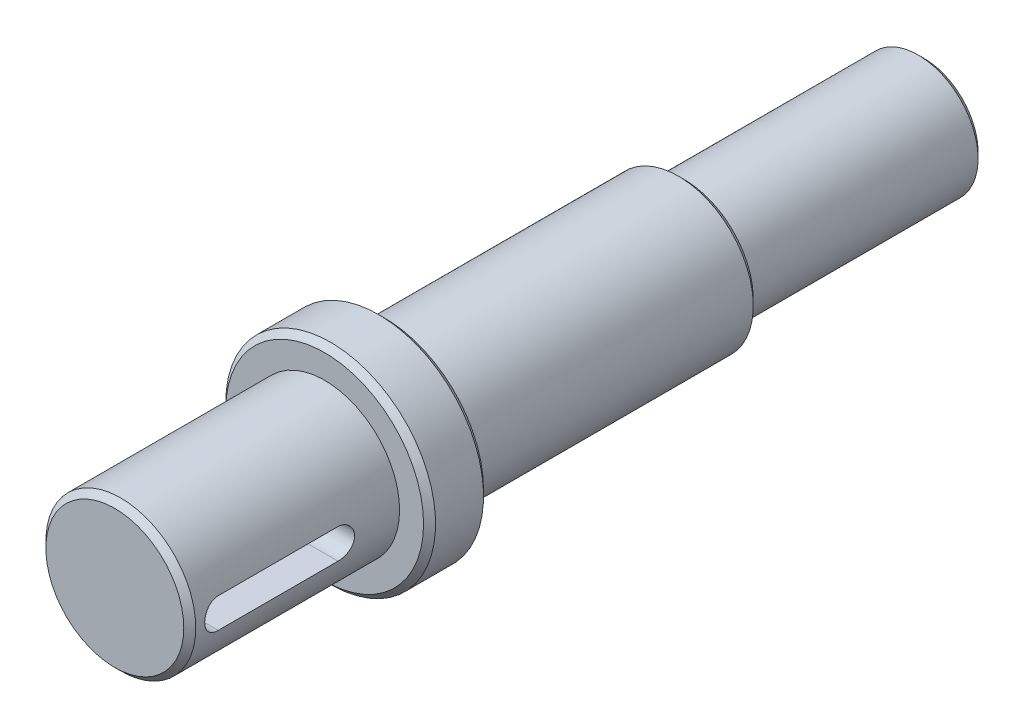
ISO-10303-21;
HEADER;
FILE_DESCRIPTION(('STEP AP214'),'2;1');
FILE_NAME('part.step','',(''),(''),'','','');
FILE_SCHEMA(('AUTOMOTIVE_DESIGN { 1 0 10303 214 1 1 1 1 }'));
ENDSEC;
DATA;
#1=APPLICATION_CONTEXT('core data for automotive mechanical design processes');
#2=APPLICATION_PROTOCOL_DEFINITION('international standard','automotive_design',2000,#1);
#3=PRODUCT_CONTEXT('',#1,'mechanical');
#4=PRODUCT('Part','Part','',(#3));
#5=PRODUCT_RELATED_PRODUCT_CATEGORY('part','',(#4));
#6=PRODUCT_DEFINITION_FORMATION('','',#4);
#7=PRODUCT_DEFINITION_CONTEXT('part definition',#1,'design');
#8=PRODUCT_DEFINITION('design','',#6,#7);
#9=PRODUCT_DEFINITION_SHAPE('','',#8);
#10=(LENGTH_UNIT() NAMED_UNIT(*) SI_UNIT(.MILLI.,.METRE.));
#11=(NAMED_UNIT(*) PLANE_ANGLE_UNIT() SI_UNIT($,.RADIAN.));
#12=(NAMED_UNIT(*) SI_UNIT($,.STERADIAN.) SOLID_ANGLE_UNIT());
#13=UNCERTAINTY_MEASURE_WITH_UNIT(LENGTH_MEASURE(1.E-05),#10,'distance_accuracy_value','');
#14=(GEOMETRIC_REPRESENTATION_CONTEXT(3) GLOBAL_UNCERTAINTY_ASSIGNED_CONTEXT((#13)) GLOBAL_UNIT_ASSIGNED_CONTEXT((#10,
#11,#12)) REPRESENTATION_CONTEXT('',''));
#15=CARTESIAN_POINT('',(0.,0.,0.));
#16=DIRECTION('',(0.,0.,1.));
#17=DIRECTION('',(1.,0.,0.));
#18=AXIS2_PLACEMENT_3D('',#15,#16,#17);
#19=CARTESIAN_POINT('',(0.,0.,35.));
#20=DIRECTION('',(0.,0.,-1.));
#21=DIRECTION('',(-1.,0.,0.));
#22=AXIS2_PLACEMENT_3D('',#19,#20,#21);
#23=CYLINDRICAL_SURFACE('',#22,12.5);
#24=CARTESIAN_POINT('',(0.,0.,0.));
#25=DIRECTION('',(0.,0.,1.));
#26=DIRECTION('',(1.,0.,0.));
#27=AXIS2_PLACEMENT_3D('',#24,#25,#26);
#28=CIRCLE('',#27,12.5);
#29=CARTESIAN_POINT('',(12.5,0.,0.));
#30=VERTEX_POINT('',#29);
#31=EDGE_CURVE('E168',#30,#30,#28,.T.);
#32=ORIENTED_EDGE('',*,*,#31,.T.);
#33=EDGE_LOOP('',(#32));
#34=FACE_BOUND('',#33,.T.);
#35=CARTESIAN_POINT('',(0.,0.,34.));
#36=DIRECTION('',(0.,0.,1.));
#37=DIRECTION('',(1.,0.,0.));
#38=AXIS2_PLACEMENT_3D('',#35,#36,#37);
#39=CIRCLE('',#38,12.5);
#40=CARTESIAN_POINT('',(12.5,0.,34.));
#41=VERTEX_POINT('',#40);
#42=EDGE_CURVE('E180',#41,#41,#39,.F.);
#43=ORIENTED_EDGE('',*,*,#42,.T.);
#44=EDGE_LOOP('',(#43));
#45=FACE_BOUND('',#44,.T.);
#46=CARTESIAN_POINT('',(12.2470560900351,2.50192268616231,30.));
#47=CARTESIAN_POINT('',(12.2470560900351,2.50192268616232,30.6628616557176));
#48=CARTESIAN_POINT('',(12.3083773624347,2.22934837842556,31.3089124055849));
#49=CARTESIAN_POINT('',(12.4399756662146,1.30887467408931,32.2293705312062));
#50=CARTESIAN_POINT('',(12.4998935106686,0.656443199650502,32.5013906485135));
#51=CARTESIAN_POINT('',(12.5001061593629,-0.652381373952432,32.502453075236));
#52=CARTESIAN_POINT('',(12.4407898216976,-1.30293601546792,32.2348312599263));
#53=CARTESIAN_POINT('',(12.3078228494961,-2.23347047293656,31.3052672780958));
#54=CARTESIAN_POINT('',(12.2470560900351,-2.50192268616232,30.6628659983858));
#55=CARTESIAN_POINT('',(12.2470560900351,-2.50192268616232,30.));
#56=B_SPLINE_CURVE_WITH_KNOTS('',3,(#46,#47,#48,#49,#50,#51,#52,#53,#54,#55),.UNSPECIFIED.,.F.,
.F.,(4,2,2,2,4),(0.,0.25,0.5,0.75,1.),.UNSPECIFIED.);
#57=CARTESIAN_POINT('',(12.2470560900351,2.50192268616231,30.));
#58=VERTEX_POINT('',#57);
#59=CARTESIAN_POINT('',(12.2470560900351,-2.50192268616232,30.));
#60=VERTEX_POINT('',#59);
#61=EDGE_CURVE('E171',#58,#60,#56,.T.);
#62=ORIENTED_EDGE('',*,*,#61,.F.);
#63=DIRECTION('',(0.,0.,-1.));
#64=VECTOR('',#63,1.);
#65=CARTESIAN_POINT('',(12.2470560900351,2.50192268616231,35.));
#66=LINE('',#65,#64);
#67=CARTESIAN_POINT('',(12.2470560900351,2.50192268616232,10.));
#68=VERTEX_POINT('',#67);
#69=EDGE_CURVE('E360',#58,#68,#66,.T.);
#70=ORIENTED_EDGE('',*,*,#69,.T.);
#71=CARTESIAN_POINT('',(12.2470560900351,-2.50192268616232,10.));
#72=CARTESIAN_POINT('',(12.2470560900351,-2.50192268616232,9.33713834428244));
#73=CARTESIAN_POINT('',(12.3083773624347,-2.22934837842557,8.69108759441507));
#74=CARTESIAN_POINT('',(12.4399756662146,-1.30887467408931,7.77062946879384));
#75=CARTESIAN_POINT('',(12.4998935106686,-0.656443199650506,7.49860935148653));
#76=CARTESIAN_POINT('',(12.5001061593629,0.652381373952431,7.49754692476403));
#77=CARTESIAN_POINT('',(12.4407898216976,1.30293601546792,7.76516874007375));
#78=CARTESIAN_POINT('',(12.3078228494961,2.23347047293656,8.69473272190425));
#79=CARTESIAN_POINT('',(12.2470560900351,2.50192268616232,9.33713400161424));
#80=CARTESIAN_POINT('',(12.2470560900351,2.50192268616232,10.));
#81=B_SPLINE_CURVE_WITH_KNOTS('',3,(#71,#72,#73,#74,#75,#76,#77,#78,#79,#80),.UNSPECIFIED.,.F.,
.F.,(4,2,2,2,4),(0.,0.25,0.5,0.75,1.),.UNSPECIFIED.);
#82=CARTESIAN_POINT('',(12.2470560900351,-2.50192268616232,10.));
#83=VERTEX_POINT('',#82);
#84=EDGE_CURVE('E80',#83,#68,#81,.T.);
#85=ORIENTED_EDGE('',*,*,#84,.F.);
#86=DIRECTION('',(0.,0.,-1.));
#87=VECTOR('',#86,1.);
#88=CARTESIAN_POINT('',(12.2470560900351,-2.50192268616232,35.));
#89=LINE('',#88,#87);
#90=EDGE_CURVE('E119',#60,#83,#89,.T.);
#91=ORIENTED_EDGE('',*,*,#90,.F.);
#92=EDGE_LOOP('',(#62,#70,#85,#91));
#93=FACE_BOUND('',#92,.T.);
#94=ADVANCED_FACE('F51',(#34,#45,#93),#23,.T.);
#95=CARTESIAN_POINT('',(0.,0.,35.));
#96=DIRECTION('',(0.,0.,1.));
#97=DIRECTION('',(1.,0.,0.));
#98=AXIS2_PLACEMENT_3D('',#95,#96,#97);
#99=PLANE('',#98);
#100=CARTESIAN_POINT('',(0.,0.,35.));
#101=DIRECTION('',(0.,0.,1.));
#102=DIRECTION('',(1.,0.,0.));
#103=AXIS2_PLACEMENT_3D('',#100,#101,#102);
#104=CIRCLE('',#103,11.5);
#105=CARTESIAN_POINT('',(11.5,0.,35.));
#106=VERTEX_POINT('',#105);
#107=EDGE_CURVE('E177',#106,#106,#104,.T.);
#108=ORIENTED_EDGE('',*,*,#107,.T.);
#109=EDGE_LOOP('',(#108));
#110=FACE_BOUND('',#109,.T.);
#111=ADVANCED_FACE('F212',(#110),#99,.T.);
#112=CARTESIAN_POINT('',(0.,0.,-10.));
#113=DIRECTION('',(0.,0.,1.));
#114=DIRECTION('',(1.,0.,0.));
#115=AXIS2_PLACEMENT_3D('',#112,#113,#114);
#116=CYLINDRICAL_SURFACE('',#115,17.5);
#117=CARTESIAN_POINT('',(0.,0.,-1.));
#118=DIRECTION('',(0.,0.,-1.));
#119=DIRECTION('',(-1.,0.,0.));
#120=AXIS2_PLACEMENT_3D('',#117,#118,#119);
#121=CIRCLE('',#120,17.5);
#122=CARTESIAN_POINT('',(-17.5,0.,-1.));
#123=VERTEX_POINT('',#122);
#124=EDGE_CURVE('E186',#123,#123,#121,.T.);
#125=ORIENTED_EDGE('',*,*,#124,.T.);
#126=EDGE_LOOP('',(#125));
#127=FACE_BOUND('',#126,.T.);
#128=CARTESIAN_POINT('',(0.,0.,-8.99999999999999));
#129=DIRECTION('',(0.,0.,-1.));
#130=DIRECTION('',(-1.,0.,0.));
#131=AXIS2_PLACEMENT_3D('',#128,#129,#130);
#132=CIRCLE('',#131,17.5);
#133=CARTESIAN_POINT('',(-17.5,0.,-8.99999999999999));
#134=VERTEX_POINT('',#133);
#135=EDGE_CURVE('E183',#134,#134,#132,.F.);
#136=ORIENTED_EDGE('',*,*,#135,.T.);
#137=EDGE_LOOP('',(#136));
#138=FACE_BOUND('',#137,.T.);
#139=ADVANCED_FACE('F254',(#127,#138),#116,.T.);
#140=CARTESIAN_POINT('',(0.,0.,-10.));
#141=DIRECTION('',(0.,0.,-1.));
#142=DIRECTION('',(-1.,0.,0.));
#143=AXIS2_PLACEMENT_3D('',#140,#141,#142);
#144=PLANE('',#143);
#145=CARTESIAN_POINT('',(0.,0.,-10.));
#146=DIRECTION('',(0.,0.,-1.));
#147=DIRECTION('',(-1.,0.,0.));
#148=AXIS2_PLACEMENT_3D('',#145,#146,#147);
#149=CIRCLE('',#148,16.5);
#150=CARTESIAN_POINT('',(-16.5,0.,-10.));
#151=VERTEX_POINT('',#150);
#152=EDGE_CURVE('E192',#151,#151,#149,.T.);
#153=ORIENTED_EDGE('',*,*,#152,.T.);
#154=EDGE_LOOP('',(#153));
#155=FACE_BOUND('',#154,.T.);
#156=CARTESIAN_POINT('',(0.,0.,-10.));
#157=DIRECTION('',(0.,0.,-1.));
#158=DIRECTION('',(-1.,0.,0.));
#159=AXIS2_PLACEMENT_3D('',#156,#157,#158);
#160=CIRCLE('',#159,12.5);
#161=CARTESIAN_POINT('',(-12.5,0.,-10.));
#162=VERTEX_POINT('',#161);
#163=EDGE_CURVE('E165',#162,#162,#160,.T.);
#164=ORIENTED_EDGE('',*,*,#163,.F.);
#165=EDGE_LOOP('',(#164));
#166=FACE_BOUND('',#165,.T.);
#167=ADVANCED_FACE('F250',(#155,#166),#144,.T.);
#168=CARTESIAN_POINT('',(0.,0.,0.));
#169=DIRECTION('',(0.,0.,-1.));
#170=DIRECTION('',(-1.,0.,0.));
#171=AXIS2_PLACEMENT_3D('',#168,#169,#170);
#172=PLANE('',#171);
#173=CARTESIAN_POINT('',(0.,0.,0.));
#174=DIRECTION('',(0.,0.,-1.));
#175=DIRECTION('',(-1.,0.,0.));
#176=AXIS2_PLACEMENT_3D('',#173,#174,#175);
#177=CIRCLE('',#176,16.5);
#178=CARTESIAN_POINT('',(-16.5,0.,0.));
#179=VERTEX_POINT('',#178);
#180=EDGE_CURVE('E189',#179,#179,#177,.F.);
#181=ORIENTED_EDGE('',*,*,#180,.T.);
#182=EDGE_LOOP('',(#181));
#183=FACE_BOUND('',#182,.T.);
#184=ORIENTED_EDGE('',*,*,#31,.F.);
#185=EDGE_LOOP('',(#184));
#186=FACE_BOUND('',#185,.T.);
#187=ADVANCED_FACE('F253',(#183,#186),#172,.F.);
#188=CARTESIAN_POINT('',(0.,0.,-60.));
#189=DIRECTION('',(0.,0.,1.));
#190=DIRECTION('',(1.,0.,0.));
#191=AXIS2_PLACEMENT_3D('',#188,#189,#190);
#192=CYLINDRICAL_SURFACE('',#191,12.5);
#193=CARTESIAN_POINT('',(0.,0.,-59.));
#194=DIRECTION('',(0.,0.,-1.));
#195=DIRECTION('',(-1.,0.,0.));
#196=AXIS2_PLACEMENT_3D('',#193,#194,#195);
#197=CIRCLE('',#196,12.5);
#198=CARTESIAN_POINT('',(-12.5,0.,-59.));
#199=VERTEX_POINT('',#198);
#200=EDGE_CURVE('E11',#199,#199,#197,.F.);
#201=ORIENTED_EDGE('',*,*,#200,.T.);
#202=EDGE_LOOP('',(#201));
#203=FACE_BOUND('',#202,.T.);
#204=ORIENTED_EDGE('',*,*,#163,.T.);
#205=EDGE_LOOP('',(#204));
#206=FACE_BOUND('',#205,.T.);
#207=ADVANCED_FACE('F258',(#203,#206),#192,.T.);
#208=CARTESIAN_POINT('',(0.,0.,-60.));
#209=DIRECTION('',(0.,0.,-1.));
#210=DIRECTION('',(-1.,0.,0.));
#211=AXIS2_PLACEMENT_3D('',#208,#209,#210);
#212=PLANE('',#211);
#213=CARTESIAN_POINT('',(0.,0.,-60.));
#214=DIRECTION('',(0.,0.,-1.));
#215=DIRECTION('',(-1.,0.,0.));
#216=AXIS2_PLACEMENT_3D('',#213,#214,#215);
#217=CIRCLE('',#216,11.5);
#218=CARTESIAN_POINT('',(-11.5,0.,-60.));
#219=VERTEX_POINT('',#218);
#220=EDGE_CURVE('E63',#219,#219,#217,.T.);
#221=ORIENTED_EDGE('',*,*,#220,.T.);
#222=EDGE_LOOP('',(#221));
#223=FACE_BOUND('',#222,.T.);
#224=CARTESIAN_POINT('',(0.,0.,-60.));
#225=DIRECTION('',(0.,0.,-1.));
#226=DIRECTION('',(-1.,0.,0.));
#227=AXIS2_PLACEMENT_3D('',#224,#225,#226);
#228=CIRCLE('',#227,10.);
#229=CARTESIAN_POINT('',(-10.,0.,-60.));
#230=VERTEX_POINT('',#229);
#231=EDGE_CURVE('E156',#230,#230,#228,.T.);
#232=ORIENTED_EDGE('',*,*,#231,.F.);
#233=EDGE_LOOP('',(#232));
#234=FACE_BOUND('',#233,.T.);
#235=ADVANCED_FACE('F260',(#223,#234),#212,.T.);
#236=CARTESIAN_POINT('',(0.,0.,-100.));
#237=DIRECTION('',(0.,0.,1.));
#238=DIRECTION('',(1.,0.,0.));
#239=AXIS2_PLACEMENT_3D('',#236,#237,#238);
#240=CYLINDRICAL_SURFACE('',#239,10.);
#241=CARTESIAN_POINT('',(0.,0.,-99.));
#242=DIRECTION('',(0.,0.,-1.));
#243=DIRECTION('',(-1.,0.,0.));
#244=AXIS2_PLACEMENT_3D('',#241,#242,#243);
#245=CIRCLE('',#244,10.);
#246=CARTESIAN_POINT('',(-10.,0.,-99.));
#247=VERTEX_POINT('',#246);
#248=EDGE_CURVE('E174',#247,#247,#245,.F.);
#249=ORIENTED_EDGE('',*,*,#248,.T.);
#250=EDGE_LOOP('',(#249));
#251=FACE_BOUND('',#250,.T.);
#252=ORIENTED_EDGE('',*,*,#231,.T.);
#253=EDGE_LOOP('',(#252));
#254=FACE_BOUND('',#253,.T.);
#255=ADVANCED_FACE('F267',(#251,#254),#240,.T.);
#256=CARTESIAN_POINT('',(0.,0.,-100.));
#257=DIRECTION('',(0.,0.,-1.));
#258=DIRECTION('',(-1.,0.,0.));
#259=AXIS2_PLACEMENT_3D('',#256,#257,#258);
#260=PLANE('',#259);
#261=CARTESIAN_POINT('',(0.,0.,-100.));
#262=DIRECTION('',(0.,0.,-1.));
#263=DIRECTION('',(-1.,0.,0.));
#264=AXIS2_PLACEMENT_3D('',#261,#262,#263);
#265=CIRCLE('',#264,8.99999999999999);
#266=CARTESIAN_POINT('',(-8.99999999999999,0.,-100.));
#267=VERTEX_POINT('',#266);
#268=EDGE_CURVE('E164',#267,#267,#265,.T.);
#269=ORIENTED_EDGE('',*,*,#268,.T.);
#270=EDGE_LOOP('',(#269));
#271=FACE_BOUND('',#270,.T.);
#272=ADVANCED_FACE('F149',(#271),#260,.T.);
#273=CARTESIAN_POINT('',(0.,0.,-100.));
#274=DIRECTION('',(0.,0.,1.));
#275=DIRECTION('',(1.,0.,0.));
#276=AXIS2_PLACEMENT_3D('',#273,#274,#275);
#277=CONICAL_SURFACE('',#276,8.99999999999999,0.785398163397444);
#278=ORIENTED_EDGE('',*,*,#248,.F.);
#279=EDGE_LOOP('',(#278));
#280=FACE_BOUND('',#279,.T.);
#281=ORIENTED_EDGE('',*,*,#268,.F.);
#282=EDGE_LOOP('',(#281));
#283=FACE_BOUND('',#282,.T.);
#284=ADVANCED_FACE('F216',(#280,#283),#277,.T.);
#285=CARTESIAN_POINT('',(0.,0.,35.));
#286=DIRECTION('',(0.,0.,-1.));
#287=DIRECTION('',(-1.,0.,0.));
#288=AXIS2_PLACEMENT_3D('',#285,#286,#287);
#289=CONICAL_SURFACE('',#288,11.5,0.785398163397447);
#290=ORIENTED_EDGE('',*,*,#42,.F.);
#291=EDGE_LOOP('',(#290));
#292=FACE_BOUND('',#291,.T.);
#293=ORIENTED_EDGE('',*,*,#107,.F.);
#294=EDGE_LOOP('',(#293));
#295=FACE_BOUND('',#294,.T.);
#296=ADVANCED_FACE('F223',(#292,#295),#289,.T.);
#297=CARTESIAN_POINT('',(0.,0.,-1.));
#298=DIRECTION('',(0.,0.,-1.));
#299=DIRECTION('',(-1.,0.,0.));
#300=AXIS2_PLACEMENT_3D('',#297,#298,#299);
#301=CONICAL_SURFACE('',#300,17.5,0.78539816339745);
#302=ORIENTED_EDGE('',*,*,#180,.F.);
#303=EDGE_LOOP('',(#302));
#304=FACE_BOUND('',#303,.T.);
#305=ORIENTED_EDGE('',*,*,#124,.F.);
#306=EDGE_LOOP('',(#305));
#307=FACE_BOUND('',#306,.T.);
#308=ADVANCED_FACE('F230',(#304,#307),#301,.T.);
#309=CARTESIAN_POINT('',(0.,0.,-10.));
#310=DIRECTION('',(0.,0.,1.));
#311=DIRECTION('',(1.,0.,0.));
#312=AXIS2_PLACEMENT_3D('',#309,#310,#311);
#313=CONICAL_SURFACE('',#312,16.5,0.785398163397453);
#314=ORIENTED_EDGE('',*,*,#135,.F.);
#315=EDGE_LOOP('',(#314));
#316=FACE_BOUND('',#315,.T.);
#317=ORIENTED_EDGE('',*,*,#152,.F.);
#318=EDGE_LOOP('',(#317));
#319=FACE_BOUND('',#318,.T.);
#320=ADVANCED_FACE('F236',(#316,#319),#313,.T.);
#321=CARTESIAN_POINT('',(0.,0.,-60.));
#322=DIRECTION('',(0.,0.,1.));
#323=DIRECTION('',(1.,0.,0.));
#324=AXIS2_PLACEMENT_3D('',#321,#322,#323);
#325=CONICAL_SURFACE('',#324,11.5,0.78539816339745);
#326=ORIENTED_EDGE('',*,*,#200,.F.);
#327=EDGE_LOOP('',(#326));
#328=FACE_BOUND('',#327,.T.);
#329=ORIENTED_EDGE('',*,*,#220,.F.);
#330=EDGE_LOOP('',(#329));
#331=FACE_BOUND('',#330,.T.);
#332=ADVANCED_FACE('F54',(#328,#331),#325,.T.);
#333=CARTESIAN_POINT('',(-7.,0.,35.));
#334=DIRECTION('',(0.,0.,-1.));
#335=DIRECTION('',(-1.,0.,0.));
#336=AXIS2_PLACEMENT_3D('',#333,#334,#335);
#337=CYLINDRICAL_SURFACE('',#336,12.5);
#338=DIRECTION('',(0.,0.,-1.));
#339=VECTOR('',#338,1.);
#340=CARTESIAN_POINT('',(5.24705609003512,2.50192268616231,35.));
#341=LINE('',#340,#339);
#342=CARTESIAN_POINT('',(5.24705609003512,2.50192268616231,30.));
#343=VERTEX_POINT('',#342);
#344=CARTESIAN_POINT('',(5.24705609003512,2.50192268616232,10.));
#345=VERTEX_POINT('',#344);
#346=EDGE_CURVE('E361',#343,#345,#341,.T.);
#347=ORIENTED_EDGE('',*,*,#346,.F.);
#348=CARTESIAN_POINT('',(5.24705609003512,-2.50192268616232,30.));
#349=CARTESIAN_POINT('',(5.24705609003512,-2.50192268616232,30.6628659983858));
#350=CARTESIAN_POINT('',(5.30782284949612,-2.23347047293656,31.3052672780958));
#351=CARTESIAN_POINT('',(5.44078982169761,-1.30293601546792,32.2348312599263));
#352=CARTESIAN_POINT('',(5.50010615936287,-0.652381373952432,32.502453075236));
#353=CARTESIAN_POINT('',(5.49989351066857,0.656443199650502,32.5013906485135));
#354=CARTESIAN_POINT('',(5.43997566621457,1.30887467408931,32.2293705312062));
#355=CARTESIAN_POINT('',(5.30837736243468,2.22934837842556,31.3089124055849));
#356=CARTESIAN_POINT('',(5.24705609003512,2.50192268616232,30.6628616557176));
#357=CARTESIAN_POINT('',(5.24705609003512,2.50192268616231,30.));
#358=B_SPLINE_CURVE_WITH_KNOTS('',3,(#348,#349,#350,#351,#352,#353,#354,#355,#356,#357),
.UNSPECIFIED.,.F.,.F.,(4,2,2,2,4),(0.,0.25,0.5,0.75,1.),.UNSPECIFIED.);
#359=CARTESIAN_POINT('',(5.24705609003512,-2.50192268616232,30.));
#360=VERTEX_POINT('',#359);
#361=EDGE_CURVE('E98',#343,#360,#358,.F.);
#362=ORIENTED_EDGE('',*,*,#361,.T.);
#363=DIRECTION('',(0.,0.,-1.));
#364=VECTOR('',#363,1.);
#365=CARTESIAN_POINT('',(5.24705609003512,-2.50192268616232,35.));
#366=LINE('',#365,#364);
#367=CARTESIAN_POINT('',(5.24705609003512,-2.50192268616232,10.));
#368=VERTEX_POINT('',#367);
#369=EDGE_CURVE('E104',#360,#368,#366,.T.);
#370=ORIENTED_EDGE('',*,*,#369,.T.);
#371=CARTESIAN_POINT('',(5.24705609003512,2.50192268616232,10.));
#372=CARTESIAN_POINT('',(5.24705609003512,2.50192268616232,9.33713400161424));
#373=CARTESIAN_POINT('',(5.30782284949612,2.23347047293656,8.69473272190425));
#374=CARTESIAN_POINT('',(5.44078982169761,1.30293601546792,7.76516874007375));
#375=CARTESIAN_POINT('',(5.50010615936287,0.652381373952431,7.49754692476403));
#376=CARTESIAN_POINT('',(5.49989351066857,-0.656443199650506,7.49860935148653));
#377=CARTESIAN_POINT('',(5.43997566621458,-1.30887467408931,7.77062946879384));
#378=CARTESIAN_POINT('',(5.30837736243468,-2.22934837842557,8.69108759441507));
#379=CARTESIAN_POINT('',(5.24705609003512,-2.50192268616232,9.33713834428244));
#380=CARTESIAN_POINT('',(5.24705609003512,-2.50192268616232,10.));
#381=B_SPLINE_CURVE_WITH_KNOTS('',3,(#371,#372,#373,#374,#375,#376,#377,#378,#379,#380),
.UNSPECIFIED.,.F.,.F.,(4,2,2,2,4),(0.,0.25,0.5,0.75,1.),.UNSPECIFIED.);
#382=EDGE_CURVE('E107',#368,#345,#381,.F.);
#383=ORIENTED_EDGE('',*,*,#382,.T.);
#384=EDGE_LOOP('',(#347,#362,#370,#383));
#385=FACE_BOUND('',#384,.T.);
#386=ADVANCED_FACE('F121',(#385),#337,.T.);
#387=CARTESIAN_POINT('',(12.2470560900351,2.50192268616231,35.));
#388=DIRECTION('',(0.,1.,0.));
#389=DIRECTION('',(0.,0.,1.));
#390=AXIS2_PLACEMENT_3D('',#387,#388,#389);
#391=PLANE('',#390);
#392=ORIENTED_EDGE('',*,*,#346,.T.);
#393=DIRECTION('',(-1.,0.,0.));
#394=VECTOR('',#393,1.);
#395=CARTESIAN_POINT('',(12.2470560900351,2.50192268616232,10.));
#396=LINE('',#395,#394);
#397=EDGE_CURVE('E111',#68,#345,#396,.T.);
#398=ORIENTED_EDGE('',*,*,#397,.F.);
#399=ORIENTED_EDGE('',*,*,#69,.F.);
#400=DIRECTION('',(-1.,0.,0.));
#401=VECTOR('',#400,1.);
#402=CARTESIAN_POINT('',(12.2470560900351,2.50192268616231,30.));
#403=LINE('',#402,#401);
#404=EDGE_CURVE('E353',#58,#343,#403,.T.);
#405=ORIENTED_EDGE('',*,*,#404,.T.);
#406=EDGE_LOOP('',(#392,#398,#399,#405));
#407=FACE_BOUND('',#406,.T.);
#408=ADVANCED_FACE('F144',(#407),#391,.F.);
#409=CARTESIAN_POINT('',(12.2470560900351,2.50192268616231,30.));
#410=CARTESIAN_POINT('',(12.2470560900351,2.50192268616232,30.6628616557176));
#411=CARTESIAN_POINT('',(12.3083773624347,2.22934837842556,31.3089124055849));
#412=CARTESIAN_POINT('',(12.4399756662146,1.30887467408931,32.2293705312062));
#413=CARTESIAN_POINT('',(12.4998935106686,0.656443199650502,32.5013906485135));
#414=CARTESIAN_POINT('',(12.5001061593629,-0.652381373952432,32.502453075236));
#415=CARTESIAN_POINT('',(12.4407898216976,-1.30293601546792,32.2348312599263));
#416=CARTESIAN_POINT('',(12.3078228494961,-2.23347047293656,31.3052672780958));
#417=CARTESIAN_POINT('',(12.2470560900351,-2.50192268616232,30.6628659983858));
#418=CARTESIAN_POINT('',(12.2470560900351,-2.50192268616232,30.));
#419=B_SPLINE_CURVE_WITH_KNOTS('',3,(#409,#410,#411,#412,#413,#414,#415,#416,#417,#418),
.UNSPECIFIED.,.F.,.F.,(4,2,2,2,4),(0.,0.25,0.5,0.75,1.),.UNSPECIFIED.);
#420=DIRECTION('',(-1.,0.,0.));
#421=VECTOR('',#420,1.);
#422=SURFACE_OF_LINEAR_EXTRUSION('',#419,#421);
#423=ORIENTED_EDGE('',*,*,#361,.F.);
#424=ORIENTED_EDGE('',*,*,#404,.F.);
#425=ORIENTED_EDGE('',*,*,#61,.T.);
#426=DIRECTION('',(-1.,0.,0.));
#427=VECTOR('',#426,1.);
#428=CARTESIAN_POINT('',(12.2470560900351,-2.50192268616232,30.));
#429=LINE('',#428,#427);
#430=EDGE_CURVE('E71',#60,#360,#429,.T.);
#431=ORIENTED_EDGE('',*,*,#430,.T.);
#432=EDGE_LOOP('',(#423,#424,#425,#431));
#433=FACE_BOUND('',#432,.T.);
#434=ADVANCED_FACE('F145',(#433),#422,.T.);
#435=CARTESIAN_POINT('',(12.2470560900351,-2.50192268616232,35.));
#436=DIRECTION('',(0.,1.,0.));
#437=DIRECTION('',(0.,0.,1.));
#438=AXIS2_PLACEMENT_3D('',#435,#436,#437);
#439=PLANE('',#438);
#440=ORIENTED_EDGE('',*,*,#369,.F.);
#441=ORIENTED_EDGE('',*,*,#430,.F.);
#442=ORIENTED_EDGE('',*,*,#90,.T.);
#443=DIRECTION('',(-1.,0.,0.));
#444=VECTOR('',#443,1.);
#445=CARTESIAN_POINT('',(12.2470560900351,-2.50192268616232,10.));
#446=LINE('',#445,#444);
#447=EDGE_CURVE('E110',#83,#368,#446,.T.);
#448=ORIENTED_EDGE('',*,*,#447,.T.);
#449=EDGE_LOOP('',(#440,#441,#442,#448));
#450=FACE_BOUND('',#449,.T.);
#451=ADVANCED_FACE('F117',(#450),#439,.T.);
#452=CARTESIAN_POINT('',(12.2470560900351,-2.50192268616232,10.));
#453=CARTESIAN_POINT('',(12.2470560900351,-2.50192268616232,9.33713834428244));
#454=CARTESIAN_POINT('',(12.3083773624347,-2.22934837842557,8.69108759441507));
#455=CARTESIAN_POINT('',(12.4399756662146,-1.30887467408931,7.77062946879384));
#456=CARTESIAN_POINT('',(12.4998935106686,-0.656443199650506,7.49860935148653));
#457=CARTESIAN_POINT('',(12.5001061593629,0.652381373952431,7.49754692476403));
#458=CARTESIAN_POINT('',(12.4407898216976,1.30293601546792,7.76516874007375));
#459=CARTESIAN_POINT('',(12.3078228494961,2.23347047293656,8.69473272190425));
#460=CARTESIAN_POINT('',(12.2470560900351,2.50192268616232,9.33713400161424));
#461=CARTESIAN_POINT('',(12.2470560900351,2.50192268616232,10.));
#462=B_SPLINE_CURVE_WITH_KNOTS('',3,(#452,#453,#454,#455,#456,#457,#458,#459,#460,#461),
.UNSPECIFIED.,.F.,.F.,(4,2,2,2,4),(0.,0.25,0.5,0.75,1.),.UNSPECIFIED.);
#463=DIRECTION('',(-1.,0.,0.));
#464=VECTOR('',#463,1.);
#465=SURFACE_OF_LINEAR_EXTRUSION('',#462,#464);
#466=ORIENTED_EDGE('',*,*,#382,.F.);
#467=ORIENTED_EDGE('',*,*,#447,.F.);
#468=ORIENTED_EDGE('',*,*,#84,.T.);
#469=ORIENTED_EDGE('',*,*,#397,.T.);
#470=EDGE_LOOP('',(#466,#467,#468,#469));
#471=FACE_BOUND('',#470,.T.);
#472=ADVANCED_FACE('F109',(#471),#465,.T.);
#473=CLOSED_SHELL('',(#94,#111,#139,#167,#187,#207,#235,#255,#272,#284,#296,#308,#320,#332,#386,
#408,#434,#451,#472));
#474=MANIFOLD_SOLID_BREP('B2',#473);
#475=ADVANCED_BREP_SHAPE_REPRESENTATION('',(#18,#474),#14);
#476=SHAPE_DEFINITION_REPRESENTATION(#9,#475);
ENDSEC;
END-ISO-10303-21;
